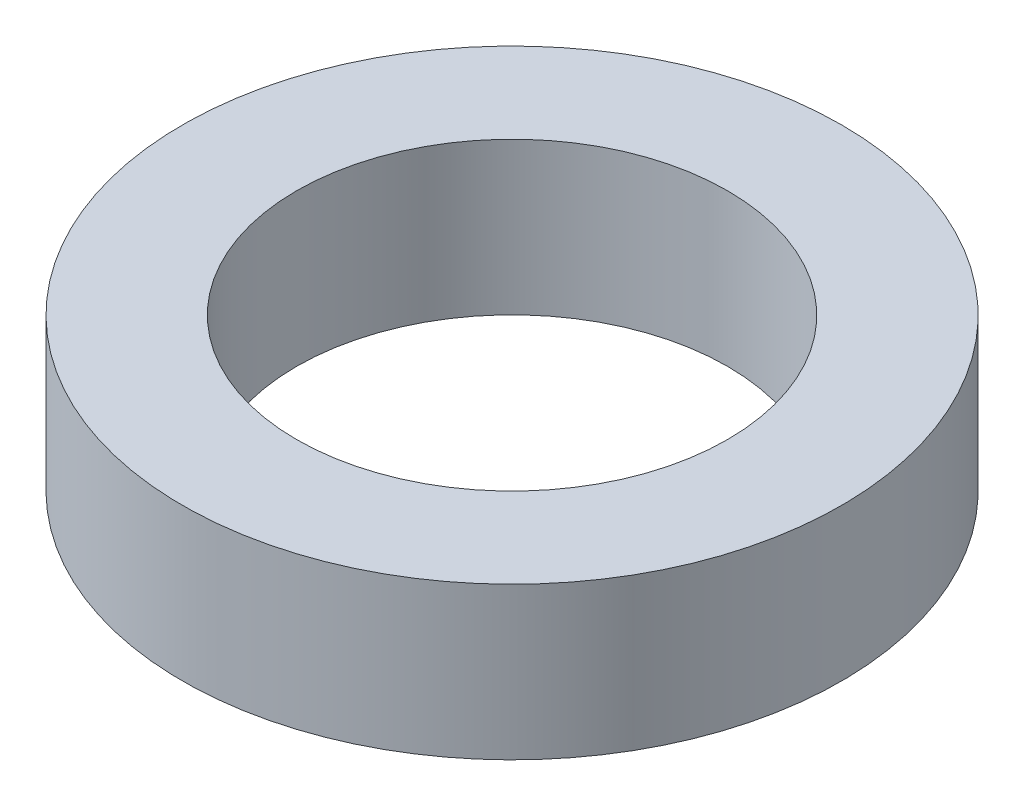
ISO-10303-21;
HEADER;
FILE_DESCRIPTION(('STEP AP214'),'2;1');
FILE_NAME('part.step','',(''),(''),'','','');
FILE_SCHEMA(('AUTOMOTIVE_DESIGN { 1 0 10303 214 1 1 1 1 }'));
ENDSEC;
DATA;
#1=APPLICATION_CONTEXT('core data for automotive mechanical design processes');
#2=APPLICATION_PROTOCOL_DEFINITION('international standard','automotive_design',2000,#1);
#3=PRODUCT_CONTEXT('',#1,'mechanical');
#4=PRODUCT('Part','Part','',(#3));
#5=PRODUCT_RELATED_PRODUCT_CATEGORY('part','',(#4));
#6=PRODUCT_DEFINITION_FORMATION('','',#4);
#7=PRODUCT_DEFINITION_CONTEXT('part definition',#1,'design');
#8=PRODUCT_DEFINITION('design','',#6,#7);
#9=PRODUCT_DEFINITION_SHAPE('','',#8);
#10=(LENGTH_UNIT() NAMED_UNIT(*) SI_UNIT(.MILLI.,.METRE.));
#11=(NAMED_UNIT(*) PLANE_ANGLE_UNIT() SI_UNIT($,.RADIAN.));
#12=(NAMED_UNIT(*) SI_UNIT($,.STERADIAN.) SOLID_ANGLE_UNIT());
#13=UNCERTAINTY_MEASURE_WITH_UNIT(LENGTH_MEASURE(1.E-05),#10,'distance_accuracy_value','');
#14=(GEOMETRIC_REPRESENTATION_CONTEXT(3) GLOBAL_UNCERTAINTY_ASSIGNED_CONTEXT((#13)) GLOBAL_UNIT_ASSIGNED_CONTEXT((#10,
#11,#12)) REPRESENTATION_CONTEXT('',''));
#15=CARTESIAN_POINT('',(0.,0.,0.));
#16=DIRECTION('',(0.,0.,1.));
#17=DIRECTION('',(1.,0.,0.));
#18=AXIS2_PLACEMENT_3D('',#15,#16,#17);
#19=CARTESIAN_POINT('',(0.,7.62,0.));
#20=DIRECTION('',(0.,1.,0.));
#21=DIRECTION('',(0.,0.,1.));
#22=AXIS2_PLACEMENT_3D('',#19,#20,#21);
#23=PLANE('',#22);
#24=CARTESIAN_POINT('',(0.,7.62,0.));
#25=DIRECTION('',(0.,1.,0.));
#26=DIRECTION('',(0.,0.,1.));
#27=AXIS2_PLACEMENT_3D('',#24,#25,#26);
#28=CIRCLE('',#27,16.51);
#29=CARTESIAN_POINT('',(0.,7.62,-16.51));
#30=VERTEX_POINT('',#29);
#31=EDGE_CURVE('E10',#30,#30,#28,.T.);
#32=ORIENTED_EDGE('',*,*,#31,.T.);
#33=EDGE_LOOP('',(#32));
#34=FACE_BOUND('',#33,.T.);
#35=CARTESIAN_POINT('',(0.,7.62,0.));
#36=DIRECTION('',(0.,1.,0.));
#37=DIRECTION('',(0.,0.,1.));
#38=AXIS2_PLACEMENT_3D('',#35,#36,#37);
#39=CIRCLE('',#38,10.795);
#40=CARTESIAN_POINT('',(0.,7.62,-10.795));
#41=VERTEX_POINT('',#40);
#42=EDGE_CURVE('E50',#41,#41,#39,.T.);
#43=ORIENTED_EDGE('',*,*,#42,.F.);
#44=EDGE_LOOP('',(#43));
#45=FACE_BOUND('',#44,.T.);
#46=ADVANCED_FACE('F37',(#34,#45),#23,.T.);
#47=CARTESIAN_POINT('',(0.,0.,0.));
#48=DIRECTION('',(0.,1.,0.));
#49=DIRECTION('',(0.,0.,1.));
#50=AXIS2_PLACEMENT_3D('',#47,#48,#49);
#51=PLANE('',#50);
#52=CARTESIAN_POINT('',(0.,0.,0.));
#53=DIRECTION('',(0.,1.,0.));
#54=DIRECTION('',(0.,0.,1.));
#55=AXIS2_PLACEMENT_3D('',#52,#53,#54);
#56=CIRCLE('',#55,16.51);
#57=CARTESIAN_POINT('',(0.,0.,-16.51));
#58=VERTEX_POINT('',#57);
#59=EDGE_CURVE('E41',#58,#58,#56,.T.);
#60=ORIENTED_EDGE('',*,*,#59,.F.);
#61=EDGE_LOOP('',(#60));
#62=FACE_BOUND('',#61,.T.);
#63=CARTESIAN_POINT('',(0.,0.,0.));
#64=DIRECTION('',(0.,1.,0.));
#65=DIRECTION('',(0.,0.,1.));
#66=AXIS2_PLACEMENT_3D('',#63,#64,#65);
#67=CIRCLE('',#66,10.795);
#68=CARTESIAN_POINT('',(0.,0.,-10.795));
#69=VERTEX_POINT('',#68);
#70=EDGE_CURVE('E52',#69,#69,#67,.T.);
#71=ORIENTED_EDGE('',*,*,#70,.T.);
#72=EDGE_LOOP('',(#71));
#73=FACE_BOUND('',#72,.T.);
#74=ADVANCED_FACE('F64',(#62,#73),#51,.F.);
#75=CARTESIAN_POINT('',(0.,7.62,0.));
#76=DIRECTION('',(0.,-1.,0.));
#77=DIRECTION('',(0.,0.,-1.));
#78=AXIS2_PLACEMENT_3D('',#75,#76,#77);
#79=CYLINDRICAL_SURFACE('',#78,16.51);
#80=CARTESIAN_POINT('',(0.,7.62,-16.51));
#81=CARTESIAN_POINT('',(0.,7.540625,-16.51));
#82=CARTESIAN_POINT('',(0.,7.46125,-16.51));
#83=CARTESIAN_POINT('',(0.,7.3025,-16.51));
#84=CARTESIAN_POINT('',(0.,7.223125,-16.51));
#85=CARTESIAN_POINT('',(0.,7.064375,-16.51));
#86=CARTESIAN_POINT('',(0.,6.985,-16.51));
#87=CARTESIAN_POINT('',(0.,6.82625,-16.51));
#88=CARTESIAN_POINT('',(0.,6.746875,-16.51));
#89=CARTESIAN_POINT('',(0.,6.588125,-16.51));
#90=CARTESIAN_POINT('',(0.,6.50875,-16.51));
#91=CARTESIAN_POINT('',(0.,6.35,-16.51));
#92=CARTESIAN_POINT('',(0.,6.270625,-16.51));
#93=CARTESIAN_POINT('',(0.,6.111875,-16.51));
#94=CARTESIAN_POINT('',(0.,6.0325,-16.51));
#95=CARTESIAN_POINT('',(0.,5.87375,-16.51));
#96=CARTESIAN_POINT('',(0.,5.794375,-16.51));
#97=CARTESIAN_POINT('',(0.,5.635625,-16.51));
#98=CARTESIAN_POINT('',(0.,5.55625,-16.51));
#99=CARTESIAN_POINT('',(0.,5.3975,-16.51));
#100=CARTESIAN_POINT('',(0.,5.318125,-16.51));
#101=CARTESIAN_POINT('',(0.,5.159375,-16.51));
#102=CARTESIAN_POINT('',(0.,5.08,-16.51));
#103=CARTESIAN_POINT('',(0.,4.92125,-16.51));
#104=CARTESIAN_POINT('',(0.,4.841875,-16.51));
#105=CARTESIAN_POINT('',(0.,4.683125,-16.51));
#106=CARTESIAN_POINT('',(0.,4.60375,-16.51));
#107=CARTESIAN_POINT('',(0.,4.445,-16.51));
#108=CARTESIAN_POINT('',(0.,4.365625,-16.51));
#109=CARTESIAN_POINT('',(0.,4.206875,-16.51));
#110=CARTESIAN_POINT('',(0.,4.1275,-16.51));
#111=CARTESIAN_POINT('',(0.,3.96875,-16.51));
#112=CARTESIAN_POINT('',(0.,3.889375,-16.51));
#113=CARTESIAN_POINT('',(0.,3.730625,-16.51));
#114=CARTESIAN_POINT('',(0.,3.65125,-16.51));
#115=CARTESIAN_POINT('',(0.,3.4925,-16.51));
#116=CARTESIAN_POINT('',(0.,3.413125,-16.51));
#117=CARTESIAN_POINT('',(0.,3.254375,-16.51));
#118=CARTESIAN_POINT('',(0.,3.175,-16.51));
#119=CARTESIAN_POINT('',(0.,3.01625,-16.51));
#120=CARTESIAN_POINT('',(0.,2.936875,-16.51));
#121=CARTESIAN_POINT('',(0.,2.778125,-16.51));
#122=CARTESIAN_POINT('',(0.,2.69875,-16.51));
#123=CARTESIAN_POINT('',(0.,2.54,-16.51));
#124=CARTESIAN_POINT('',(0.,2.460625,-16.51));
#125=CARTESIAN_POINT('',(0.,2.301875,-16.51));
#126=CARTESIAN_POINT('',(0.,2.2225,-16.51));
#127=CARTESIAN_POINT('',(0.,2.06375,-16.51));
#128=CARTESIAN_POINT('',(0.,1.984375,-16.51));
#129=CARTESIAN_POINT('',(0.,1.825625,-16.51));
#130=CARTESIAN_POINT('',(0.,1.74625,-16.51));
#131=CARTESIAN_POINT('',(0.,1.5875,-16.51));
#132=CARTESIAN_POINT('',(0.,1.508125,-16.51));
#133=CARTESIAN_POINT('',(0.,1.349375,-16.51));
#134=CARTESIAN_POINT('',(0.,1.27,-16.51));
#135=CARTESIAN_POINT('',(0.,1.11125,-16.51));
#136=CARTESIAN_POINT('',(0.,1.031875,-16.51));
#137=CARTESIAN_POINT('',(0.,0.873125,-16.51));
#138=CARTESIAN_POINT('',(0.,0.79375,-16.51));
#139=CARTESIAN_POINT('',(0.,0.635,-16.51));
#140=CARTESIAN_POINT('',(0.,0.555625,-16.51));
#141=CARTESIAN_POINT('',(0.,0.396875,-16.51));
#142=CARTESIAN_POINT('',(0.,0.3175,-16.51));
#143=CARTESIAN_POINT('',(0.,0.15875,-16.51));
#144=CARTESIAN_POINT('',(0.,0.0793749999999999,-16.51));
#145=CARTESIAN_POINT('',(0.,0.,-16.51));
#146=B_SPLINE_CURVE_WITH_KNOTS('',3,(#80,#81,#82,#83,#84,#85,#86,#87,#88,#89,#90,#91,#92,#93,
#94,#95,#96,#97,#98,#99,#100,#101,#102,#103,#104,#105,#106,#107,#108,#109,#110,#111,#112,#113,
#114,#115,#116,#117,#118,#119,#120,#121,#122,#123,#124,#125,#126,#127,#128,#129,#130,#131,#132,
#133,#134,#135,#136,#137,#138,#139,#140,#141,#142,#143,#144,#145),.UNSPECIFIED.,.F.,.F.,(4,2,2,
2,2,2,2,2,2,2,2,2,2,2,2,2,2,2,2,2,2,2,2,2,2,2,2,2,2,2,2,2,4),(0.,0.238125,0.476249999999999,
0.714375,0.952499999999999,1.190625,1.42875,1.666875,1.905,2.143125,2.38125,2.619375,2.8575,
3.095625,3.33375,3.571875,3.81,4.048125,4.28625,4.524375,4.7625,5.000625,5.23875,5.476875,5.715,
5.953125,6.19125,6.429375,6.6675,6.905625,7.14375,7.381875,7.62),.UNSPECIFIED.);
#147=EDGE_CURVE('BSEAM39',#30,#58,#146,.T.);
#148=ORIENTED_EDGE('',*,*,#31,.F.);
#149=ORIENTED_EDGE('',*,*,#59,.T.);
#150=ORIENTED_EDGE('',*,*,#147,.T.);
#151=ORIENTED_EDGE('',*,*,#147,.F.);
#152=EDGE_LOOP('',(#148,#150,#149,#151));
#153=FACE_BOUND('',#152,.T.);
#154=ADVANCED_FACE('F39',(#153),#79,.T.);
#155=CARTESIAN_POINT('',(0.,7.62,0.));
#156=DIRECTION('',(0.,-1.,0.));
#157=DIRECTION('',(0.,0.,-1.));
#158=AXIS2_PLACEMENT_3D('',#155,#156,#157);
#159=CYLINDRICAL_SURFACE('',#158,10.795);
#160=CARTESIAN_POINT('',(0.,7.62,-10.795));
#161=CARTESIAN_POINT('',(0.,7.540625,-10.795));
#162=CARTESIAN_POINT('',(0.,7.46125,-10.795));
#163=CARTESIAN_POINT('',(0.,7.3025,-10.795));
#164=CARTESIAN_POINT('',(0.,7.223125,-10.795));
#165=CARTESIAN_POINT('',(0.,7.064375,-10.795));
#166=CARTESIAN_POINT('',(0.,6.985,-10.795));
#167=CARTESIAN_POINT('',(0.,6.82625,-10.795));
#168=CARTESIAN_POINT('',(0.,6.746875,-10.795));
#169=CARTESIAN_POINT('',(0.,6.588125,-10.795));
#170=CARTESIAN_POINT('',(0.,6.50875,-10.795));
#171=CARTESIAN_POINT('',(0.,6.35,-10.795));
#172=CARTESIAN_POINT('',(0.,6.270625,-10.795));
#173=CARTESIAN_POINT('',(0.,6.111875,-10.795));
#174=CARTESIAN_POINT('',(0.,6.0325,-10.795));
#175=CARTESIAN_POINT('',(0.,5.87375,-10.795));
#176=CARTESIAN_POINT('',(0.,5.794375,-10.795));
#177=CARTESIAN_POINT('',(0.,5.635625,-10.795));
#178=CARTESIAN_POINT('',(0.,5.55625,-10.795));
#179=CARTESIAN_POINT('',(0.,5.3975,-10.795));
#180=CARTESIAN_POINT('',(0.,5.318125,-10.795));
#181=CARTESIAN_POINT('',(0.,5.159375,-10.795));
#182=CARTESIAN_POINT('',(0.,5.08,-10.795));
#183=CARTESIAN_POINT('',(0.,4.92125,-10.795));
#184=CARTESIAN_POINT('',(0.,4.841875,-10.795));
#185=CARTESIAN_POINT('',(0.,4.683125,-10.795));
#186=CARTESIAN_POINT('',(0.,4.60375,-10.795));
#187=CARTESIAN_POINT('',(0.,4.445,-10.795));
#188=CARTESIAN_POINT('',(0.,4.365625,-10.795));
#189=CARTESIAN_POINT('',(0.,4.206875,-10.795));
#190=CARTESIAN_POINT('',(0.,4.1275,-10.795));
#191=CARTESIAN_POINT('',(0.,3.96875,-10.795));
#192=CARTESIAN_POINT('',(0.,3.889375,-10.795));
#193=CARTESIAN_POINT('',(0.,3.730625,-10.795));
#194=CARTESIAN_POINT('',(0.,3.65125,-10.795));
#195=CARTESIAN_POINT('',(0.,3.4925,-10.795));
#196=CARTESIAN_POINT('',(0.,3.413125,-10.795));
#197=CARTESIAN_POINT('',(0.,3.254375,-10.795));
#198=CARTESIAN_POINT('',(0.,3.175,-10.795));
#199=CARTESIAN_POINT('',(0.,3.01625,-10.795));
#200=CARTESIAN_POINT('',(0.,2.936875,-10.795));
#201=CARTESIAN_POINT('',(0.,2.778125,-10.795));
#202=CARTESIAN_POINT('',(0.,2.69875,-10.795));
#203=CARTESIAN_POINT('',(0.,2.54,-10.795));
#204=CARTESIAN_POINT('',(0.,2.460625,-10.795));
#205=CARTESIAN_POINT('',(0.,2.301875,-10.795));
#206=CARTESIAN_POINT('',(0.,2.2225,-10.795));
#207=CARTESIAN_POINT('',(0.,2.06375,-10.795));
#208=CARTESIAN_POINT('',(0.,1.984375,-10.795));
#209=CARTESIAN_POINT('',(0.,1.825625,-10.795));
#210=CARTESIAN_POINT('',(0.,1.74625,-10.795));
#211=CARTESIAN_POINT('',(0.,1.5875,-10.795));
#212=CARTESIAN_POINT('',(0.,1.508125,-10.795));
#213=CARTESIAN_POINT('',(0.,1.349375,-10.795));
#214=CARTESIAN_POINT('',(0.,1.27,-10.795));
#215=CARTESIAN_POINT('',(0.,1.11125,-10.795));
#216=CARTESIAN_POINT('',(0.,1.031875,-10.795));
#217=CARTESIAN_POINT('',(0.,0.873125,-10.795));
#218=CARTESIAN_POINT('',(0.,0.79375,-10.795));
#219=CARTESIAN_POINT('',(0.,0.635,-10.795));
#220=CARTESIAN_POINT('',(0.,0.555625,-10.795));
#221=CARTESIAN_POINT('',(0.,0.396875,-10.795));
#222=CARTESIAN_POINT('',(0.,0.3175,-10.795));
#223=CARTESIAN_POINT('',(0.,0.15875,-10.795));
#224=CARTESIAN_POINT('',(0.,0.0793749999999999,-10.795));
#225=CARTESIAN_POINT('',(0.,0.,-10.795));
#226=B_SPLINE_CURVE_WITH_KNOTS('',3,(#160,#161,#162,#163,#164,#165,#166,#167,#168,#169,#170,
#171,#172,#173,#174,#175,#176,#177,#178,#179,#180,#181,#182,#183,#184,#185,#186,#187,#188,#189,
#190,#191,#192,#193,#194,#195,#196,#197,#198,#199,#200,#201,#202,#203,#204,#205,#206,#207,#208,
#209,#210,#211,#212,#213,#214,#215,#216,#217,#218,#219,#220,#221,#222,#223,#224,#225),
.UNSPECIFIED.,.F.,.F.,(4,2,2,2,2,2,2,2,2,2,2,2,2,2,2,2,2,2,2,2,2,2,2,2,2,2,2,2,2,2,2,2,4),(0.,
0.238125,0.476249999999999,0.714375,0.952499999999999,1.190625,1.42875,1.666875,1.905,2.143125,
2.38125,2.619375,2.8575,3.095625,3.33375,3.571875,3.81,4.048125,4.28625,4.524375,4.7625,
5.000625,5.23875,5.476875,5.715,5.953125,6.19125,6.429375,6.6675,6.905625,7.14375,7.381875,
7.62),.UNSPECIFIED.);
#227=EDGE_CURVE('BSEAM60',#41,#69,#226,.T.);
#228=ORIENTED_EDGE('',*,*,#42,.T.);
#229=ORIENTED_EDGE('',*,*,#70,.F.);
#230=ORIENTED_EDGE('',*,*,#227,.T.);
#231=ORIENTED_EDGE('',*,*,#227,.F.);
#232=EDGE_LOOP('',(#228,#230,#229,#231));
#233=FACE_BOUND('',#232,.T.);
#234=ADVANCED_FACE('F60',(#233),#159,.F.);
#235=CLOSED_SHELL('',(#46,#74,#154,#234));
#236=MANIFOLD_SOLID_BREP('B2',#235);
#237=ADVANCED_BREP_SHAPE_REPRESENTATION('',(#18,#236),#14);
#238=SHAPE_DEFINITION_REPRESENTATION(#9,#237);
ENDSEC;
END-ISO-10303-21;
